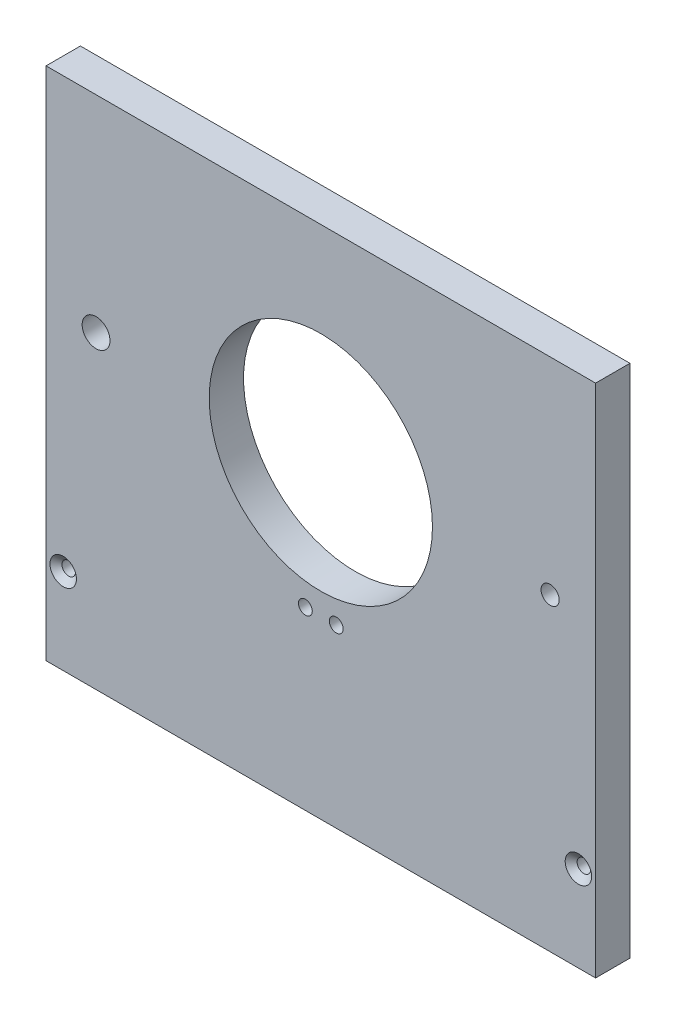
ISO-10303-21;
HEADER;
FILE_DESCRIPTION(('STEP AP214'),'2;1');
FILE_NAME('part.step','',(''),(''),'','','');
FILE_SCHEMA(('AUTOMOTIVE_DESIGN { 1 0 10303 214 1 1 1 1 }'));
ENDSEC;
DATA;
#1=APPLICATION_CONTEXT('core data for automotive mechanical design processes');
#2=APPLICATION_PROTOCOL_DEFINITION('international standard','automotive_design',2000,#1);
#3=PRODUCT_CONTEXT('',#1,'mechanical');
#4=PRODUCT('Part','Part','',(#3));
#5=PRODUCT_RELATED_PRODUCT_CATEGORY('part','',(#4));
#6=PRODUCT_DEFINITION_FORMATION('','',#4);
#7=PRODUCT_DEFINITION_CONTEXT('part definition',#1,'design');
#8=PRODUCT_DEFINITION('design','',#6,#7);
#9=PRODUCT_DEFINITION_SHAPE('','',#8);
#10=(LENGTH_UNIT() NAMED_UNIT(*) SI_UNIT(.MILLI.,.METRE.));
#11=(NAMED_UNIT(*) PLANE_ANGLE_UNIT() SI_UNIT($,.RADIAN.));
#12=(NAMED_UNIT(*) SI_UNIT($,.STERADIAN.) SOLID_ANGLE_UNIT());
#13=UNCERTAINTY_MEASURE_WITH_UNIT(LENGTH_MEASURE(1.E-05),#10,'distance_accuracy_value','');
#14=(GEOMETRIC_REPRESENTATION_CONTEXT(3) GLOBAL_UNCERTAINTY_ASSIGNED_CONTEXT((#13)) GLOBAL_UNIT_ASSIGNED_CONTEXT((#10,
#11,#12)) REPRESENTATION_CONTEXT('',''));
#15=CARTESIAN_POINT('',(0.,0.,0.));
#16=DIRECTION('',(0.,0.,1.));
#17=DIRECTION('',(1.,0.,0.));
#18=AXIS2_PLACEMENT_3D('',#15,#16,#17);
#19=CARTESIAN_POINT('',(-101.6,-95.25,12.7));
#20=DIRECTION('',(-1.,0.,0.));
#21=DIRECTION('',(0.,0.,1.));
#22=AXIS2_PLACEMENT_3D('',#19,#20,#21);
#23=PLANE('',#22);
#24=DIRECTION('',(0.,1.,0.));
#25=VECTOR('',#24,1.);
#26=CARTESIAN_POINT('',(-101.6,-95.25,0.));
#27=LINE('',#26,#25);
#28=CARTESIAN_POINT('',(-101.6,-95.25,0.));
#29=VERTEX_POINT('',#28);
#30=CARTESIAN_POINT('',(-101.6,95.25,0.));
#31=VERTEX_POINT('',#30);
#32=EDGE_CURVE('E133',#29,#31,#27,.T.);
#33=ORIENTED_EDGE('',*,*,#32,.F.);
#34=DIRECTION('',(0.,0.,-1.));
#35=VECTOR('',#34,1.);
#36=CARTESIAN_POINT('',(-101.6,-95.25,12.7));
#37=LINE('',#36,#35);
#38=CARTESIAN_POINT('',(-101.6,-95.25,12.7));
#39=VERTEX_POINT('',#38);
#40=EDGE_CURVE('E11',#39,#29,#37,.T.);
#41=ORIENTED_EDGE('',*,*,#40,.F.);
#42=DIRECTION('',(0.,1.,0.));
#43=VECTOR('',#42,1.);
#44=CARTESIAN_POINT('',(-101.6,-95.25,12.7));
#45=LINE('',#44,#43);
#46=CARTESIAN_POINT('',(-101.6,95.25,12.7));
#47=VERTEX_POINT('',#46);
#48=EDGE_CURVE('E136',#39,#47,#45,.T.);
#49=ORIENTED_EDGE('',*,*,#48,.T.);
#50=DIRECTION('',(0.,0.,-1.));
#51=VECTOR('',#50,1.);
#52=CARTESIAN_POINT('',(-101.6,95.25,12.7));
#53=LINE('',#52,#51);
#54=EDGE_CURVE('E38',#47,#31,#53,.T.);
#55=ORIENTED_EDGE('',*,*,#54,.T.);
#56=EDGE_LOOP('',(#33,#41,#49,#55));
#57=FACE_BOUND('',#56,.T.);
#58=ADVANCED_FACE('F35',(#57),#23,.T.);
#59=CARTESIAN_POINT('',(-101.6,-95.25,12.7));
#60=DIRECTION('',(0.,1.,0.));
#61=DIRECTION('',(0.,0.,1.));
#62=AXIS2_PLACEMENT_3D('',#59,#60,#61);
#63=PLANE('',#62);
#64=CARTESIAN_POINT('',(-82.55,-95.25,6.35));
#65=DIRECTION('',(0.,-1.,0.));
#66=DIRECTION('',(0.,0.,-1.));
#67=AXIS2_PLACEMENT_3D('',#64,#65,#66);
#68=CIRCLE('',#67,2.01929999999999);
#69=CARTESIAN_POINT('',(-82.55,-95.25,4.33070000000001));
#70=VERTEX_POINT('',#69);
#71=EDGE_CURVE('E99',#70,#70,#68,.T.);
#72=ORIENTED_EDGE('',*,*,#71,.F.);
#73=EDGE_LOOP('',(#72));
#74=FACE_BOUND('',#73,.T.);
#75=CARTESIAN_POINT('',(0.,-95.25,6.35));
#76=DIRECTION('',(0.,-1.,0.));
#77=DIRECTION('',(0.,0.,-1.));
#78=AXIS2_PLACEMENT_3D('',#75,#76,#77);
#79=CIRCLE('',#78,2.01929999999999);
#80=CARTESIAN_POINT('',(0.,-95.25,4.33070000000001));
#81=VERTEX_POINT('',#80);
#82=EDGE_CURVE('E98',#81,#81,#79,.T.);
#83=ORIENTED_EDGE('',*,*,#82,.F.);
#84=EDGE_LOOP('',(#83));
#85=FACE_BOUND('',#84,.T.);
#86=CARTESIAN_POINT('',(82.55,-95.25,6.35));
#87=DIRECTION('',(0.,-1.,0.));
#88=DIRECTION('',(0.,0.,-1.));
#89=AXIS2_PLACEMENT_3D('',#86,#87,#88);
#90=CIRCLE('',#89,2.01929999999999);
#91=CARTESIAN_POINT('',(82.55,-95.25,4.33070000000001));
#92=VERTEX_POINT('',#91);
#93=EDGE_CURVE('E111',#92,#92,#90,.T.);
#94=ORIENTED_EDGE('',*,*,#93,.F.);
#95=EDGE_LOOP('',(#94));
#96=FACE_BOUND('',#95,.T.);
#97=DIRECTION('',(1.,0.,0.));
#98=VECTOR('',#97,1.);
#99=CARTESIAN_POINT('',(-101.6,-95.25,0.));
#100=LINE('',#99,#98);
#101=CARTESIAN_POINT('',(101.6,-95.25,0.));
#102=VERTEX_POINT('',#101);
#103=EDGE_CURVE('E69',#29,#102,#100,.T.);
#104=ORIENTED_EDGE('',*,*,#103,.T.);
#105=DIRECTION('',(0.,0.,-1.));
#106=VECTOR('',#105,1.);
#107=CARTESIAN_POINT('',(101.6,-95.25,12.7));
#108=LINE('',#107,#106);
#109=CARTESIAN_POINT('',(101.6,-95.25,12.7));
#110=VERTEX_POINT('',#109);
#111=EDGE_CURVE('E44',#110,#102,#108,.T.);
#112=ORIENTED_EDGE('',*,*,#111,.F.);
#113=DIRECTION('',(1.,0.,0.));
#114=VECTOR('',#113,1.);
#115=CARTESIAN_POINT('',(-101.6,-95.25,12.7));
#116=LINE('',#115,#114);
#117=EDGE_CURVE('E142',#39,#110,#116,.T.);
#118=ORIENTED_EDGE('',*,*,#117,.F.);
#119=ORIENTED_EDGE('',*,*,#40,.T.);
#120=EDGE_LOOP('',(#104,#112,#118,#119));
#121=FACE_BOUND('',#120,.T.);
#122=ADVANCED_FACE('F163',(#74,#85,#96,#121),#63,.F.);
#123=CARTESIAN_POINT('',(101.6,-95.25,12.7));
#124=DIRECTION('',(-1.,0.,0.));
#125=DIRECTION('',(0.,0.,1.));
#126=AXIS2_PLACEMENT_3D('',#123,#124,#125);
#127=PLANE('',#126);
#128=DIRECTION('',(0.,1.,0.));
#129=VECTOR('',#128,1.);
#130=CARTESIAN_POINT('',(101.6,-95.25,0.));
#131=LINE('',#130,#129);
#132=CARTESIAN_POINT('',(101.6,95.25,0.));
#133=VERTEX_POINT('',#132);
#134=EDGE_CURVE('E149',#102,#133,#131,.T.);
#135=ORIENTED_EDGE('',*,*,#134,.T.);
#136=DIRECTION('',(0.,0.,-1.));
#137=VECTOR('',#136,1.);
#138=CARTESIAN_POINT('',(101.6,95.25,12.7));
#139=LINE('',#138,#137);
#140=CARTESIAN_POINT('',(101.6,95.25,12.7));
#141=VERTEX_POINT('',#140);
#142=EDGE_CURVE('E153',#141,#133,#139,.T.);
#143=ORIENTED_EDGE('',*,*,#142,.F.);
#144=DIRECTION('',(0.,1.,0.));
#145=VECTOR('',#144,1.);
#146=CARTESIAN_POINT('',(101.6,-95.25,12.7));
#147=LINE('',#146,#145);
#148=EDGE_CURVE('E140',#110,#141,#147,.T.);
#149=ORIENTED_EDGE('',*,*,#148,.F.);
#150=ORIENTED_EDGE('',*,*,#111,.T.);
#151=EDGE_LOOP('',(#135,#143,#149,#150));
#152=FACE_BOUND('',#151,.T.);
#153=ADVANCED_FACE('F161',(#152),#127,.F.);
#154=CARTESIAN_POINT('',(-101.6,95.25,12.7));
#155=DIRECTION('',(0.,1.,0.));
#156=DIRECTION('',(0.,0.,1.));
#157=AXIS2_PLACEMENT_3D('',#154,#155,#156);
#158=PLANE('',#157);
#159=DIRECTION('',(1.,0.,0.));
#160=VECTOR('',#159,1.);
#161=CARTESIAN_POINT('',(-101.6,95.25,0.));
#162=LINE('',#161,#160);
#163=EDGE_CURVE('E146',#31,#133,#162,.T.);
#164=ORIENTED_EDGE('',*,*,#163,.F.);
#165=ORIENTED_EDGE('',*,*,#54,.F.);
#166=DIRECTION('',(1.,0.,0.));
#167=VECTOR('',#166,1.);
#168=CARTESIAN_POINT('',(-101.6,95.25,12.7));
#169=LINE('',#168,#167);
#170=EDGE_CURVE('E138',#47,#141,#169,.T.);
#171=ORIENTED_EDGE('',*,*,#170,.T.);
#172=ORIENTED_EDGE('',*,*,#142,.T.);
#173=EDGE_LOOP('',(#164,#165,#171,#172));
#174=FACE_BOUND('',#173,.T.);
#175=ADVANCED_FACE('F156',(#174),#158,.T.);
#176=CARTESIAN_POINT('',(0.,0.,12.7));
#177=DIRECTION('',(0.,0.,-1.));
#178=DIRECTION('',(-1.,0.,0.));
#179=AXIS2_PLACEMENT_3D('',#176,#177,#178);
#180=PLANE('',#179);
#181=CARTESIAN_POINT('',(-5.71500000000003,-30.1625,12.7));
#182=DIRECTION('',(0.,0.,1.));
#183=DIRECTION('',(1.,0.,0.));
#184=AXIS2_PLACEMENT_3D('',#181,#182,#183);
#185=CIRCLE('',#184,2.55269999999999);
#186=CARTESIAN_POINT('',(-3.16230000000004,-30.1625,12.7));
#187=VERTEX_POINT('',#186);
#188=EDGE_CURVE('E355',#187,#187,#185,.T.);
#189=ORIENTED_EDGE('',*,*,#188,.F.);
#190=EDGE_LOOP('',(#189));
#191=FACE_BOUND('',#190,.T.);
#192=CARTESIAN_POINT('',(5.71499999999997,-30.1625,12.7));
#193=DIRECTION('',(0.,0.,1.));
#194=DIRECTION('',(1.,0.,0.));
#195=AXIS2_PLACEMENT_3D('',#192,#193,#194);
#196=CIRCLE('',#195,2.55269999999999);
#197=CARTESIAN_POINT('',(8.26769999999996,-30.1625,12.7));
#198=VERTEX_POINT('',#197);
#199=EDGE_CURVE('E357',#198,#198,#196,.T.);
#200=ORIENTED_EDGE('',*,*,#199,.F.);
#201=EDGE_LOOP('',(#200));
#202=FACE_BOUND('',#201,.T.);
#203=CARTESIAN_POINT('',(-95.25,-63.5,12.7));
#204=DIRECTION('',(0.,0.,1.));
#205=DIRECTION('',(1.,0.,0.));
#206=AXIS2_PLACEMENT_3D('',#203,#204,#205);
#207=CIRCLE('',#206,4.88950000000001);
#208=CARTESIAN_POINT('',(-90.3605,-63.5,12.7));
#209=VERTEX_POINT('',#208);
#210=EDGE_CURVE('E365',#209,#209,#207,.T.);
#211=ORIENTED_EDGE('',*,*,#210,.F.);
#212=EDGE_LOOP('',(#211));
#213=FACE_BOUND('',#212,.T.);
#214=CARTESIAN_POINT('',(95.25,-63.5,12.7));
#215=DIRECTION('',(0.,0.,1.));
#216=DIRECTION('',(1.,0.,0.));
#217=AXIS2_PLACEMENT_3D('',#214,#215,#216);
#218=CIRCLE('',#217,4.88950000000001);
#219=CARTESIAN_POINT('',(100.1395,-63.5,12.7));
#220=VERTEX_POINT('',#219);
#221=EDGE_CURVE('E374',#220,#220,#218,.T.);
#222=ORIENTED_EDGE('',*,*,#221,.F.);
#223=EDGE_LOOP('',(#222));
#224=FACE_BOUND('',#223,.T.);
#225=CARTESIAN_POINT('',(84.7847497567208,19.05,12.7));
#226=DIRECTION('',(0.,0.,1.));
#227=DIRECTION('',(1.,0.,0.));
#228=AXIS2_PLACEMENT_3D('',#225,#226,#227);
#229=CIRCLE('',#228,3.36549999999999);
#230=CARTESIAN_POINT('',(88.1502497567208,19.05,12.7));
#231=VERTEX_POINT('',#230);
#232=EDGE_CURVE('E117',#231,#231,#229,.T.);
#233=ORIENTED_EDGE('',*,*,#232,.F.);
#234=EDGE_LOOP('',(#233));
#235=FACE_BOUND('',#234,.T.);
#236=CARTESIAN_POINT('',(-83.1092502432792,19.05,12.7));
#237=DIRECTION('',(0.,0.,1.));
#238=DIRECTION('',(1.,0.,0.));
#239=AXIS2_PLACEMENT_3D('',#236,#237,#238);
#240=CIRCLE('',#239,5.1435);
#241=CARTESIAN_POINT('',(-77.9657502432792,19.05,12.7));
#242=VERTEX_POINT('',#241);
#243=EDGE_CURVE('E121',#242,#242,#240,.T.);
#244=ORIENTED_EDGE('',*,*,#243,.F.);
#245=EDGE_LOOP('',(#244));
#246=FACE_BOUND('',#245,.T.);
#247=CARTESIAN_POINT('',(0.,19.05,12.7));
#248=DIRECTION('',(0.,0.,1.));
#249=DIRECTION('',(1.,0.,0.));
#250=AXIS2_PLACEMENT_3D('',#247,#248,#249);
#251=CIRCLE('',#250,41.275);
#252=CARTESIAN_POINT('',(41.2749999999999,19.05,12.7));
#253=VERTEX_POINT('',#252);
#254=EDGE_CURVE('E127',#253,#253,#251,.T.);
#255=ORIENTED_EDGE('',*,*,#254,.F.);
#256=EDGE_LOOP('',(#255));
#257=FACE_BOUND('',#256,.T.);
#258=ORIENTED_EDGE('',*,*,#48,.F.);
#259=ORIENTED_EDGE('',*,*,#117,.T.);
#260=ORIENTED_EDGE('',*,*,#148,.T.);
#261=ORIENTED_EDGE('',*,*,#170,.F.);
#262=EDGE_LOOP('',(#258,#259,#260,#261));
#263=FACE_BOUND('',#262,.T.);
#264=ADVANCED_FACE('F165',(#191,#202,#213,#224,#235,#246,#257,#263),#180,.F.);
#265=CARTESIAN_POINT('',(0.,0.,0.));
#266=DIRECTION('',(0.,0.,-1.));
#267=DIRECTION('',(-1.,0.,0.));
#268=AXIS2_PLACEMENT_3D('',#265,#266,#267);
#269=PLANE('',#268);
#270=CARTESIAN_POINT('',(-5.71500000000003,-30.1625,0.));
#271=DIRECTION('',(0.,0.,1.));
#272=DIRECTION('',(1.,0.,0.));
#273=AXIS2_PLACEMENT_3D('',#270,#271,#272);
#274=CIRCLE('',#273,2.5527);
#275=CARTESIAN_POINT('',(-3.16230000000003,-30.1625,0.));
#276=VERTEX_POINT('',#275);
#277=EDGE_CURVE('E353',#276,#276,#274,.T.);
#278=ORIENTED_EDGE('',*,*,#277,.T.);
#279=EDGE_LOOP('',(#278));
#280=FACE_BOUND('',#279,.T.);
#281=CARTESIAN_POINT('',(5.71499999999997,-30.1625,0.));
#282=DIRECTION('',(0.,0.,1.));
#283=DIRECTION('',(1.,0.,0.));
#284=AXIS2_PLACEMENT_3D('',#281,#282,#283);
#285=CIRCLE('',#284,2.5527);
#286=CARTESIAN_POINT('',(8.26769999999997,-30.1625,0.));
#287=VERTEX_POINT('',#286);
#288=EDGE_CURVE('E362',#287,#287,#285,.T.);
#289=ORIENTED_EDGE('',*,*,#288,.T.);
#290=EDGE_LOOP('',(#289));
#291=FACE_BOUND('',#290,.T.);
#292=CARTESIAN_POINT('',(-95.25,-63.5,0.));
#293=DIRECTION('',(0.,0.,1.));
#294=DIRECTION('',(1.,0.,0.));
#295=AXIS2_PLACEMENT_3D('',#292,#293,#294);
#296=CIRCLE('',#295,2.4892);
#297=CARTESIAN_POINT('',(-92.7608,-63.5,0.));
#298=VERTEX_POINT('',#297);
#299=EDGE_CURVE('E371',#298,#298,#296,.T.);
#300=ORIENTED_EDGE('',*,*,#299,.T.);
#301=EDGE_LOOP('',(#300));
#302=FACE_BOUND('',#301,.T.);
#303=CARTESIAN_POINT('',(95.25,-63.5,0.));
#304=DIRECTION('',(0.,0.,1.));
#305=DIRECTION('',(1.,0.,0.));
#306=AXIS2_PLACEMENT_3D('',#303,#304,#305);
#307=CIRCLE('',#306,2.4892);
#308=CARTESIAN_POINT('',(97.7392,-63.5,0.));
#309=VERTEX_POINT('',#308);
#310=EDGE_CURVE('E105',#309,#309,#307,.T.);
#311=ORIENTED_EDGE('',*,*,#310,.T.);
#312=EDGE_LOOP('',(#311));
#313=FACE_BOUND('',#312,.T.);
#314=CARTESIAN_POINT('',(84.7847497567208,19.05,0.));
#315=DIRECTION('',(0.,0.,1.));
#316=DIRECTION('',(1.,0.,0.));
#317=AXIS2_PLACEMENT_3D('',#314,#315,#316);
#318=CIRCLE('',#317,3.36549999999999);
#319=CARTESIAN_POINT('',(88.1502497567208,19.05,0.));
#320=VERTEX_POINT('',#319);
#321=EDGE_CURVE('E118',#320,#320,#318,.T.);
#322=ORIENTED_EDGE('',*,*,#321,.T.);
#323=EDGE_LOOP('',(#322));
#324=FACE_BOUND('',#323,.T.);
#325=CARTESIAN_POINT('',(-83.1092502432792,19.05,0.));
#326=DIRECTION('',(0.,0.,1.));
#327=DIRECTION('',(1.,0.,0.));
#328=AXIS2_PLACEMENT_3D('',#325,#326,#327);
#329=CIRCLE('',#328,5.1435);
#330=CARTESIAN_POINT('',(-77.9657502432792,19.05,0.));
#331=VERTEX_POINT('',#330);
#332=EDGE_CURVE('E124',#331,#331,#329,.T.);
#333=ORIENTED_EDGE('',*,*,#332,.T.);
#334=EDGE_LOOP('',(#333));
#335=FACE_BOUND('',#334,.T.);
#336=CARTESIAN_POINT('',(0.,19.05,0.));
#337=DIRECTION('',(0.,0.,1.));
#338=DIRECTION('',(1.,0.,0.));
#339=AXIS2_PLACEMENT_3D('',#336,#337,#338);
#340=CIRCLE('',#339,41.275);
#341=CARTESIAN_POINT('',(41.2749999999999,19.05,0.));
#342=VERTEX_POINT('',#341);
#343=EDGE_CURVE('E130',#342,#342,#340,.T.);
#344=ORIENTED_EDGE('',*,*,#343,.T.);
#345=EDGE_LOOP('',(#344));
#346=FACE_BOUND('',#345,.T.);
#347=ORIENTED_EDGE('',*,*,#32,.T.);
#348=ORIENTED_EDGE('',*,*,#163,.T.);
#349=ORIENTED_EDGE('',*,*,#134,.F.);
#350=ORIENTED_EDGE('',*,*,#103,.F.);
#351=EDGE_LOOP('',(#347,#348,#349,#350));
#352=FACE_BOUND('',#351,.T.);
#353=ADVANCED_FACE('F159',(#280,#291,#302,#313,#324,#335,#346,#352),#269,.T.);
#354=CARTESIAN_POINT('',(0.,19.05,0.));
#355=DIRECTION('',(0.,0.,1.));
#356=DIRECTION('',(1.,0.,0.));
#357=AXIS2_PLACEMENT_3D('',#354,#355,#356);
#358=CYLINDRICAL_SURFACE('',#357,41.275);
#359=ORIENTED_EDGE('',*,*,#343,.F.);
#360=EDGE_LOOP('',(#359));
#361=FACE_BOUND('',#360,.T.);
#362=ORIENTED_EDGE('',*,*,#254,.T.);
#363=EDGE_LOOP('',(#362));
#364=FACE_BOUND('',#363,.T.);
#365=ADVANCED_FACE('F173',(#361,#364),#358,.F.);
#366=CARTESIAN_POINT('',(-83.1092502432792,19.05,0.));
#367=DIRECTION('',(0.,0.,1.));
#368=DIRECTION('',(1.,0.,0.));
#369=AXIS2_PLACEMENT_3D('',#366,#367,#368);
#370=CYLINDRICAL_SURFACE('',#369,5.1435);
#371=ORIENTED_EDGE('',*,*,#332,.F.);
#372=EDGE_LOOP('',(#371));
#373=FACE_BOUND('',#372,.T.);
#374=ORIENTED_EDGE('',*,*,#243,.T.);
#375=EDGE_LOOP('',(#374));
#376=FACE_BOUND('',#375,.T.);
#377=ADVANCED_FACE('F215',(#373,#376),#370,.F.);
#378=CARTESIAN_POINT('',(84.7847497567208,19.05,0.));
#379=DIRECTION('',(0.,0.,1.));
#380=DIRECTION('',(1.,0.,0.));
#381=AXIS2_PLACEMENT_3D('',#378,#379,#380);
#382=CYLINDRICAL_SURFACE('',#381,3.36549999999999);
#383=ORIENTED_EDGE('',*,*,#321,.F.);
#384=EDGE_LOOP('',(#383));
#385=FACE_BOUND('',#384,.T.);
#386=ORIENTED_EDGE('',*,*,#232,.T.);
#387=EDGE_LOOP('',(#386));
#388=FACE_BOUND('',#387,.T.);
#389=ADVANCED_FACE('F207',(#385,#388),#382,.F.);
#390=CARTESIAN_POINT('',(82.55,-69.85,6.35));
#391=DIRECTION('',(0.,-1.,0.));
#392=DIRECTION('',(0.,0.,-1.));
#393=AXIS2_PLACEMENT_3D('',#390,#391,#392);
#394=CONICAL_SURFACE('',#393,2.01929999999999,1.02974425867666);
#395=CARTESIAN_POINT('',(82.55,-68.6366821519977,6.35));
#396=VERTEX_POINT('',#395);
#397=VERTEX_LOOP('',#396);
#398=FACE_BOUND('',#397,.T.);
#399=CARTESIAN_POINT('',(82.55,-69.85,6.35));
#400=DIRECTION('',(0.,-1.,0.));
#401=DIRECTION('',(0.,0.,-1.));
#402=AXIS2_PLACEMENT_3D('',#399,#400,#401);
#403=CIRCLE('',#402,2.01929999999999);
#404=CARTESIAN_POINT('',(82.55,-69.85,4.33070000000001));
#405=VERTEX_POINT('',#404);
#406=EDGE_CURVE('E114',#405,#405,#403,.T.);
#407=ORIENTED_EDGE('',*,*,#406,.T.);
#408=EDGE_LOOP('',(#407));
#409=FACE_BOUND('',#408,.T.);
#410=ADVANCED_FACE('F198',(#398,#409),#394,.F.);
#411=CARTESIAN_POINT('',(82.55,-95.25,6.35));
#412=DIRECTION('',(0.,-1.,0.));
#413=DIRECTION('',(0.,0.,-1.));
#414=AXIS2_PLACEMENT_3D('',#411,#412,#413);
#415=CYLINDRICAL_SURFACE('',#414,2.01929999999999);
#416=ORIENTED_EDGE('',*,*,#406,.F.);
#417=EDGE_LOOP('',(#416));
#418=FACE_BOUND('',#417,.T.);
#419=ORIENTED_EDGE('',*,*,#93,.T.);
#420=EDGE_LOOP('',(#419));
#421=FACE_BOUND('',#420,.T.);
#422=ADVANCED_FACE('F195',(#418,#421),#415,.F.);
#423=CARTESIAN_POINT('',(0.,-69.85,6.35));
#424=DIRECTION('',(0.,-1.,0.));
#425=DIRECTION('',(0.,0.,-1.));
#426=AXIS2_PLACEMENT_3D('',#423,#424,#425);
#427=CONICAL_SURFACE('',#426,2.01929999999999,1.02974425867665);
#428=CARTESIAN_POINT('',(0.,-68.6366821519977,6.35));
#429=VERTEX_POINT('',#428);
#430=VERTEX_LOOP('',#429);
#431=FACE_BOUND('',#430,.T.);
#432=CARTESIAN_POINT('',(0.,-69.85,6.35));
#433=DIRECTION('',(0.,-1.,0.));
#434=DIRECTION('',(0.,0.,-1.));
#435=AXIS2_PLACEMENT_3D('',#432,#433,#434);
#436=CIRCLE('',#435,2.01929999999999);
#437=CARTESIAN_POINT('',(0.,-69.85,4.33070000000001));
#438=VERTEX_POINT('',#437);
#439=EDGE_CURVE('E102',#438,#438,#436,.T.);
#440=ORIENTED_EDGE('',*,*,#439,.T.);
#441=EDGE_LOOP('',(#440));
#442=FACE_BOUND('',#441,.T.);
#443=ADVANCED_FACE('F197',(#431,#442),#427,.F.);
#444=CARTESIAN_POINT('',(0.,-95.25,6.35));
#445=DIRECTION('',(0.,-1.,0.));
#446=DIRECTION('',(0.,0.,-1.));
#447=AXIS2_PLACEMENT_3D('',#444,#445,#446);
#448=CYLINDRICAL_SURFACE('',#447,2.01929999999999);
#449=ORIENTED_EDGE('',*,*,#439,.F.);
#450=EDGE_LOOP('',(#449));
#451=FACE_BOUND('',#450,.T.);
#452=ORIENTED_EDGE('',*,*,#82,.T.);
#453=EDGE_LOOP('',(#452));
#454=FACE_BOUND('',#453,.T.);
#455=ADVANCED_FACE('F92',(#451,#454),#448,.F.);
#456=CARTESIAN_POINT('',(-82.55,-69.85,6.35));
#457=DIRECTION('',(0.,-1.,0.));
#458=DIRECTION('',(0.,0.,-1.));
#459=AXIS2_PLACEMENT_3D('',#456,#457,#458);
#460=CONICAL_SURFACE('',#459,2.01929999999999,1.02974425867666);
#461=CARTESIAN_POINT('',(-82.55,-68.6366821519977,6.35));
#462=VERTEX_POINT('',#461);
#463=VERTEX_LOOP('',#462);
#464=FACE_BOUND('',#463,.T.);
#465=CARTESIAN_POINT('',(-82.55,-69.85,6.35));
#466=DIRECTION('',(0.,-1.,0.));
#467=DIRECTION('',(0.,0.,-1.));
#468=AXIS2_PLACEMENT_3D('',#465,#466,#467);
#469=CIRCLE('',#468,2.01929999999999);
#470=CARTESIAN_POINT('',(-82.55,-69.85,4.33070000000001));
#471=VERTEX_POINT('',#470);
#472=EDGE_CURVE('E96',#471,#471,#469,.T.);
#473=ORIENTED_EDGE('',*,*,#472,.T.);
#474=EDGE_LOOP('',(#473));
#475=FACE_BOUND('',#474,.T.);
#476=ADVANCED_FACE('F88',(#464,#475),#460,.F.);
#477=CARTESIAN_POINT('',(-82.55,-95.25,6.35));
#478=DIRECTION('',(0.,-1.,0.));
#479=DIRECTION('',(0.,0.,-1.));
#480=AXIS2_PLACEMENT_3D('',#477,#478,#479);
#481=CYLINDRICAL_SURFACE('',#480,2.01929999999999);
#482=ORIENTED_EDGE('',*,*,#472,.F.);
#483=EDGE_LOOP('',(#482));
#484=FACE_BOUND('',#483,.T.);
#485=ORIENTED_EDGE('',*,*,#71,.T.);
#486=EDGE_LOOP('',(#485));
#487=FACE_BOUND('',#486,.T.);
#488=ADVANCED_FACE('F91',(#484,#487),#481,.F.);
#489=CARTESIAN_POINT('',(95.25,-63.5,12.7));
#490=DIRECTION('',(0.,0.,1.));
#491=DIRECTION('',(1.,0.,0.));
#492=AXIS2_PLACEMENT_3D('',#489,#490,#491);
#493=CYLINDRICAL_SURFACE('',#492,2.48919999999999);
#494=ORIENTED_EDGE('',*,*,#310,.F.);
#495=EDGE_LOOP('',(#494));
#496=FACE_BOUND('',#495,.T.);
#497=CARTESIAN_POINT('',(95.25,-63.5,10.6859091552852));
#498=DIRECTION('',(0.,0.,1.));
#499=DIRECTION('',(1.,0.,0.));
#500=AXIS2_PLACEMENT_3D('',#497,#498,#499);
#501=CIRCLE('',#500,2.48919999999998);
#502=CARTESIAN_POINT('',(97.7392,-63.5,10.6859091552852));
#503=VERTEX_POINT('',#502);
#504=EDGE_CURVE('E377',#503,#503,#501,.T.);
#505=ORIENTED_EDGE('',*,*,#504,.T.);
#506=EDGE_LOOP('',(#505));
#507=FACE_BOUND('',#506,.T.);
#508=ADVANCED_FACE('F278',(#496,#507),#493,.F.);
#509=CARTESIAN_POINT('',(95.25,-63.5,12.7));
#510=DIRECTION('',(0.,0.,1.));
#511=DIRECTION('',(1.,0.,0.));
#512=AXIS2_PLACEMENT_3D('',#509,#510,#511);
#513=CONICAL_SURFACE('',#512,4.88950000000001,0.87266462599717);
#514=ORIENTED_EDGE('',*,*,#504,.F.);
#515=EDGE_LOOP('',(#514));
#516=FACE_BOUND('',#515,.T.);
#517=ORIENTED_EDGE('',*,*,#221,.T.);
#518=EDGE_LOOP('',(#517));
#519=FACE_BOUND('',#518,.T.);
#520=ADVANCED_FACE('F287',(#516,#519),#513,.F.);
#521=CARTESIAN_POINT('',(-95.25,-63.5,12.7));
#522=DIRECTION('',(0.,0.,1.));
#523=DIRECTION('',(1.,0.,0.));
#524=AXIS2_PLACEMENT_3D('',#521,#522,#523);
#525=CYLINDRICAL_SURFACE('',#524,2.48919999999999);
#526=ORIENTED_EDGE('',*,*,#299,.F.);
#527=EDGE_LOOP('',(#526));
#528=FACE_BOUND('',#527,.T.);
#529=CARTESIAN_POINT('',(-95.25,-63.5,10.6859091552852));
#530=DIRECTION('',(0.,0.,1.));
#531=DIRECTION('',(1.,0.,0.));
#532=AXIS2_PLACEMENT_3D('',#529,#530,#531);
#533=CIRCLE('',#532,2.48919999999998);
#534=CARTESIAN_POINT('',(-92.7608,-63.5,10.6859091552852));
#535=VERTEX_POINT('',#534);
#536=EDGE_CURVE('E368',#535,#535,#533,.T.);
#537=ORIENTED_EDGE('',*,*,#536,.T.);
#538=EDGE_LOOP('',(#537));
#539=FACE_BOUND('',#538,.T.);
#540=ADVANCED_FACE('F297',(#528,#539),#525,.F.);
#541=CARTESIAN_POINT('',(-95.25,-63.5,12.7));
#542=DIRECTION('',(0.,0.,1.));
#543=DIRECTION('',(1.,0.,0.));
#544=AXIS2_PLACEMENT_3D('',#541,#542,#543);
#545=CONICAL_SURFACE('',#544,4.88950000000001,0.87266462599717);
#546=ORIENTED_EDGE('',*,*,#536,.F.);
#547=EDGE_LOOP('',(#546));
#548=FACE_BOUND('',#547,.T.);
#549=ORIENTED_EDGE('',*,*,#210,.T.);
#550=EDGE_LOOP('',(#549));
#551=FACE_BOUND('',#550,.T.);
#552=ADVANCED_FACE('F307',(#548,#551),#545,.F.);
#553=CARTESIAN_POINT('',(5.71499999999997,-30.1625,12.7));
#554=DIRECTION('',(0.,0.,1.));
#555=DIRECTION('',(1.,0.,0.));
#556=AXIS2_PLACEMENT_3D('',#553,#554,#555);
#557=CYLINDRICAL_SURFACE('',#556,2.55269999999999);
#558=ORIENTED_EDGE('',*,*,#288,.F.);
#559=EDGE_LOOP('',(#558));
#560=FACE_BOUND('',#559,.T.);
#561=ORIENTED_EDGE('',*,*,#199,.T.);
#562=EDGE_LOOP('',(#561));
#563=FACE_BOUND('',#562,.T.);
#564=ADVANCED_FACE('F316',(#560,#563),#557,.F.);
#565=CARTESIAN_POINT('',(-5.71500000000003,-30.1625,12.7));
#566=DIRECTION('',(0.,0.,1.));
#567=DIRECTION('',(1.,0.,0.));
#568=AXIS2_PLACEMENT_3D('',#565,#566,#567);
#569=CYLINDRICAL_SURFACE('',#568,2.55269999999999);
#570=ORIENTED_EDGE('',*,*,#277,.F.);
#571=EDGE_LOOP('',(#570));
#572=FACE_BOUND('',#571,.T.);
#573=ORIENTED_EDGE('',*,*,#188,.T.);
#574=EDGE_LOOP('',(#573));
#575=FACE_BOUND('',#574,.T.);
#576=ADVANCED_FACE('F336',(#572,#575),#569,.F.);
#577=CLOSED_SHELL('',(#58,#122,#153,#175,#264,#353,#365,#377,#389,#410,#422,#443,#455,#476,#488,
#508,#520,#540,#552,#564,#576));
#578=MANIFOLD_SOLID_BREP('B2',#577);
#579=ADVANCED_BREP_SHAPE_REPRESENTATION('',(#18,#578),#14);
#580=SHAPE_DEFINITION_REPRESENTATION(#9,#579);
ENDSEC;
END-ISO-10303-21;
